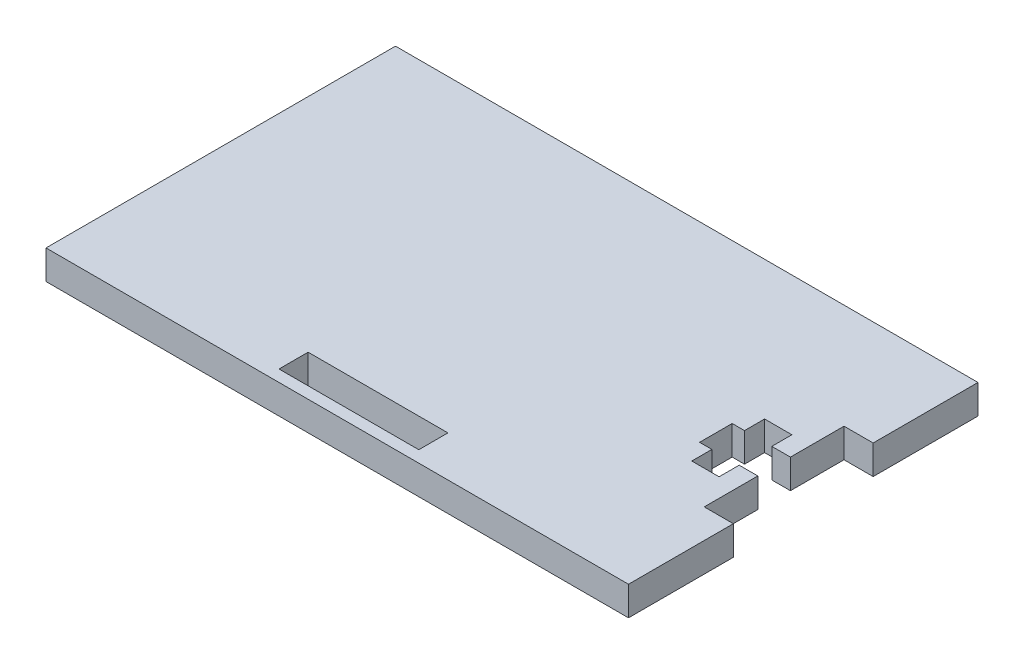
ISO-10303-21;
HEADER;
FILE_DESCRIPTION(('STEP AP214'),'2;1');
FILE_NAME('part.step','',(''),(''),'','','');
FILE_SCHEMA(('AUTOMOTIVE_DESIGN { 1 0 10303 214 1 1 1 1 }'));
ENDSEC;
DATA;
#1=APPLICATION_CONTEXT('core data for automotive mechanical design processes');
#2=APPLICATION_PROTOCOL_DEFINITION('international standard','automotive_design',2000,#1);
#3=PRODUCT_CONTEXT('',#1,'mechanical');
#4=PRODUCT('Part','Part','',(#3));
#5=PRODUCT_RELATED_PRODUCT_CATEGORY('part','',(#4));
#6=PRODUCT_DEFINITION_FORMATION('','',#4);
#7=PRODUCT_DEFINITION_CONTEXT('part definition',#1,'design');
#8=PRODUCT_DEFINITION('design','',#6,#7);
#9=PRODUCT_DEFINITION_SHAPE('','',#8);
#10=(LENGTH_UNIT() NAMED_UNIT(*) SI_UNIT(.MILLI.,.METRE.));
#11=(NAMED_UNIT(*) PLANE_ANGLE_UNIT() SI_UNIT($,.RADIAN.));
#12=(NAMED_UNIT(*) SI_UNIT($,.STERADIAN.) SOLID_ANGLE_UNIT());
#13=UNCERTAINTY_MEASURE_WITH_UNIT(LENGTH_MEASURE(1.E-05),#10,'distance_accuracy_value','');
#14=(GEOMETRIC_REPRESENTATION_CONTEXT(3) GLOBAL_UNCERTAINTY_ASSIGNED_CONTEXT((#13)) GLOBAL_UNIT_ASSIGNED_CONTEXT((#10,
#11,#12)) REPRESENTATION_CONTEXT('',''));
#15=CARTESIAN_POINT('',(0.,0.,0.));
#16=DIRECTION('',(0.,0.,1.));
#17=DIRECTION('',(1.,0.,0.));
#18=AXIS2_PLACEMENT_3D('',#15,#16,#17);
#19=CARTESIAN_POINT('',(0.,3.175,0.));
#20=DIRECTION('',(0.,-1.,0.));
#21=DIRECTION('',(0.,0.,-1.));
#22=AXIS2_PLACEMENT_3D('',#19,#20,#21);
#23=PLANE('',#22);
#24=DIRECTION('',(0.,0.,1.));
#25=VECTOR('',#24,1.);
#26=CARTESIAN_POINT('',(0.,3.175,0.));
#27=LINE('',#26,#25);
#28=CARTESIAN_POINT('',(0.,3.175,-38.1));
#29=VERTEX_POINT('',#28);
#30=CARTESIAN_POINT('',(0.,3.175,0.));
#31=VERTEX_POINT('',#30);
#32=EDGE_CURVE('E230',#29,#31,#27,.T.);
#33=ORIENTED_EDGE('',*,*,#32,.T.);
#34=DIRECTION('',(1.,0.,0.));
#35=VECTOR('',#34,1.);
#36=CARTESIAN_POINT('',(0.,3.175,0.));
#37=LINE('',#36,#35);
#38=CARTESIAN_POINT('',(63.5,3.175,0.));
#39=VERTEX_POINT('',#38);
#40=EDGE_CURVE('E233',#31,#39,#37,.T.);
#41=ORIENTED_EDGE('',*,*,#40,.T.);
#42=DIRECTION('',(0.,0.,-1.));
#43=VECTOR('',#42,1.);
#44=CARTESIAN_POINT('',(63.5,3.175,0.));
#45=LINE('',#44,#43);
#46=CARTESIAN_POINT('',(63.5,3.175,-11.43));
#47=VERTEX_POINT('',#46);
#48=EDGE_CURVE('E236',#39,#47,#45,.T.);
#49=ORIENTED_EDGE('',*,*,#48,.T.);
#50=DIRECTION('',(-1.,0.,0.));
#51=VECTOR('',#50,1.);
#52=CARTESIAN_POINT('',(60.325,3.175,-11.43));
#53=LINE('',#52,#51);
#54=CARTESIAN_POINT('',(60.325,3.175,-11.43));
#55=VERTEX_POINT('',#54);
#56=EDGE_CURVE('E238',#47,#55,#53,.T.);
#57=ORIENTED_EDGE('',*,*,#56,.T.);
#58=DIRECTION('',(0.,0.,-1.));
#59=VECTOR('',#58,1.);
#60=CARTESIAN_POINT('',(60.325,3.175,-17.272));
#61=LINE('',#60,#59);
#62=CARTESIAN_POINT('',(60.325,3.175,-17.272));
#63=VERTEX_POINT('',#62);
#64=EDGE_CURVE('E240',#55,#63,#61,.T.);
#65=ORIENTED_EDGE('',*,*,#64,.T.);
#66=DIRECTION('',(-1.,0.,0.));
#67=VECTOR('',#66,1.);
#68=CARTESIAN_POINT('',(58.293,3.175,-17.272));
#69=LINE('',#68,#67);
#70=CARTESIAN_POINT('',(58.293,3.175,-17.272));
#71=VERTEX_POINT('',#70);
#72=EDGE_CURVE('E242',#63,#71,#69,.T.);
#73=ORIENTED_EDGE('',*,*,#72,.T.);
#74=DIRECTION('',(0.,0.,1.));
#75=VECTOR('',#74,1.);
#76=CARTESIAN_POINT('',(58.293,3.175,-17.272));
#77=LINE('',#76,#75);
#78=CARTESIAN_POINT('',(58.293,3.175,-15.08125));
#79=VERTEX_POINT('',#78);
#80=EDGE_CURVE('E244',#71,#79,#77,.T.);
#81=ORIENTED_EDGE('',*,*,#80,.T.);
#82=DIRECTION('',(-1.,0.,0.));
#83=VECTOR('',#82,1.);
#84=CARTESIAN_POINT('',(55.3164375,3.175,-15.08125));
#85=LINE('',#84,#83);
#86=CARTESIAN_POINT('',(55.3164375,3.175,-15.08125));
#87=VERTEX_POINT('',#86);
#88=EDGE_CURVE('E246',#79,#87,#85,.T.);
#89=ORIENTED_EDGE('',*,*,#88,.T.);
#90=DIRECTION('',(0.,0.,-1.));
#91=VECTOR('',#90,1.);
#92=CARTESIAN_POINT('',(55.3164375,3.175,-17.272));
#93=LINE('',#92,#91);
#94=CARTESIAN_POINT('',(55.3164375,3.175,-17.272));
#95=VERTEX_POINT('',#94);
#96=EDGE_CURVE('E248',#87,#95,#93,.T.);
#97=ORIENTED_EDGE('',*,*,#96,.T.);
#98=DIRECTION('',(-1.,0.,0.));
#99=VECTOR('',#98,1.);
#100=CARTESIAN_POINT('',(53.975,3.175,-17.272));
#101=LINE('',#100,#99);
#102=CARTESIAN_POINT('',(53.975,3.175,-17.272));
#103=VERTEX_POINT('',#102);
#104=EDGE_CURVE('E250',#95,#103,#101,.T.);
#105=ORIENTED_EDGE('',*,*,#104,.T.);
#106=DIRECTION('',(0.,0.,-1.));
#107=VECTOR('',#106,1.);
#108=CARTESIAN_POINT('',(53.975,3.175,-20.828));
#109=LINE('',#108,#107);
#110=CARTESIAN_POINT('',(53.975,3.175,-20.828));
#111=VERTEX_POINT('',#110);
#112=EDGE_CURVE('E252',#103,#111,#109,.T.);
#113=ORIENTED_EDGE('',*,*,#112,.T.);
#114=DIRECTION('',(1.,0.,0.));
#115=VECTOR('',#114,1.);
#116=CARTESIAN_POINT('',(53.975,3.175,-20.828));
#117=LINE('',#116,#115);
#118=CARTESIAN_POINT('',(55.3164375,3.175,-20.828));
#119=VERTEX_POINT('',#118);
#120=EDGE_CURVE('E254',#111,#119,#117,.T.);
#121=ORIENTED_EDGE('',*,*,#120,.T.);
#122=DIRECTION('',(0.,0.,-1.));
#123=VECTOR('',#122,1.);
#124=CARTESIAN_POINT('',(55.3164375,3.175,-23.01875));
#125=LINE('',#124,#123);
#126=CARTESIAN_POINT('',(55.3164375,3.175,-23.01875));
#127=VERTEX_POINT('',#126);
#128=EDGE_CURVE('E256',#119,#127,#125,.T.);
#129=ORIENTED_EDGE('',*,*,#128,.T.);
#130=DIRECTION('',(1.,0.,0.));
#131=VECTOR('',#130,1.);
#132=CARTESIAN_POINT('',(55.3164375,3.175,-23.01875));
#133=LINE('',#132,#131);
#134=CARTESIAN_POINT('',(58.293,3.175,-23.01875));
#135=VERTEX_POINT('',#134);
#136=EDGE_CURVE('E258',#127,#135,#133,.T.);
#137=ORIENTED_EDGE('',*,*,#136,.T.);
#138=DIRECTION('',(0.,0.,1.));
#139=VECTOR('',#138,1.);
#140=CARTESIAN_POINT('',(58.293,3.175,-23.01875));
#141=LINE('',#140,#139);
#142=CARTESIAN_POINT('',(58.293,3.175,-20.828));
#143=VERTEX_POINT('',#142);
#144=EDGE_CURVE('E260',#135,#143,#141,.T.);
#145=ORIENTED_EDGE('',*,*,#144,.T.);
#146=DIRECTION('',(1.,0.,0.));
#147=VECTOR('',#146,1.);
#148=CARTESIAN_POINT('',(58.293,3.175,-20.828));
#149=LINE('',#148,#147);
#150=CARTESIAN_POINT('',(60.325,3.175,-20.828));
#151=VERTEX_POINT('',#150);
#152=EDGE_CURVE('E262',#143,#151,#149,.T.);
#153=ORIENTED_EDGE('',*,*,#152,.T.);
#154=DIRECTION('',(0.,0.,-1.));
#155=VECTOR('',#154,1.);
#156=CARTESIAN_POINT('',(60.325,3.175,-26.67));
#157=LINE('',#156,#155);
#158=CARTESIAN_POINT('',(60.325,3.175,-26.67));
#159=VERTEX_POINT('',#158);
#160=EDGE_CURVE('E264',#151,#159,#157,.T.);
#161=ORIENTED_EDGE('',*,*,#160,.T.);
#162=DIRECTION('',(1.,0.,0.));
#163=VECTOR('',#162,1.);
#164=CARTESIAN_POINT('',(63.5,3.175,-26.67));
#165=LINE('',#164,#163);
#166=CARTESIAN_POINT('',(63.5,3.175,-26.67));
#167=VERTEX_POINT('',#166);
#168=EDGE_CURVE('E266',#159,#167,#165,.T.);
#169=ORIENTED_EDGE('',*,*,#168,.T.);
#170=DIRECTION('',(0.,0.,-1.));
#171=VECTOR('',#170,1.);
#172=CARTESIAN_POINT('',(63.5,3.175,-26.67));
#173=LINE('',#172,#171);
#174=CARTESIAN_POINT('',(63.5,3.175,-38.1));
#175=VERTEX_POINT('',#174);
#176=EDGE_CURVE('E268',#167,#175,#173,.T.);
#177=ORIENTED_EDGE('',*,*,#176,.T.);
#178=DIRECTION('',(-1.,0.,0.));
#179=VECTOR('',#178,1.);
#180=CARTESIAN_POINT('',(0.,3.175,-38.1));
#181=LINE('',#180,#179);
#182=EDGE_CURVE('E270',#175,#29,#181,.T.);
#183=ORIENTED_EDGE('',*,*,#182,.T.);
#184=EDGE_LOOP('',(#33,#41,#49,#57,#65,#73,#81,#89,#97,#105,#113,#121,#129,#137,#145,#153,#161,
#169,#177,#183));
#185=FACE_BOUND('',#184,.T.);
#186=DIRECTION('',(0.,0.,1.));
#187=VECTOR('',#186,1.);
#188=CARTESIAN_POINT('',(24.13,3.175,-4.445));
#189=LINE('',#188,#187);
#190=CARTESIAN_POINT('',(24.13,3.175,-4.445));
#191=VERTEX_POINT('',#190);
#192=CARTESIAN_POINT('',(24.13,3.175,-1.27));
#193=VERTEX_POINT('',#192);
#194=EDGE_CURVE('E194',#191,#193,#189,.T.);
#195=ORIENTED_EDGE('',*,*,#194,.F.);
#196=DIRECTION('',(-1.,0.,0.));
#197=VECTOR('',#196,1.);
#198=CARTESIAN_POINT('',(24.13,3.175,-4.445));
#199=LINE('',#198,#197);
#200=CARTESIAN_POINT('',(39.37,3.175,-4.445));
#201=VERTEX_POINT('',#200);
#202=EDGE_CURVE('E216',#201,#191,#199,.T.);
#203=ORIENTED_EDGE('',*,*,#202,.F.);
#204=DIRECTION('',(0.,0.,-1.));
#205=VECTOR('',#204,1.);
#206=CARTESIAN_POINT('',(39.37,3.175,-4.445));
#207=LINE('',#206,#205);
#208=CARTESIAN_POINT('',(39.37,3.175,-1.27));
#209=VERTEX_POINT('',#208);
#210=EDGE_CURVE('E214',#209,#201,#207,.T.);
#211=ORIENTED_EDGE('',*,*,#210,.F.);
#212=DIRECTION('',(1.,0.,0.));
#213=VECTOR('',#212,1.);
#214=CARTESIAN_POINT('',(24.13,3.175,-1.27));
#215=LINE('',#214,#213);
#216=EDGE_CURVE('E202',#193,#209,#215,.T.);
#217=ORIENTED_EDGE('',*,*,#216,.F.);
#218=EDGE_LOOP('',(#195,#203,#211,#217));
#219=FACE_BOUND('',#218,.T.);
#220=ADVANCED_FACE('F33',(#185,#219),#23,.F.);
#221=CARTESIAN_POINT('',(0.,0.,0.));
#222=DIRECTION('',(0.,-1.,0.));
#223=DIRECTION('',(0.,0.,-1.));
#224=AXIS2_PLACEMENT_3D('',#221,#222,#223);
#225=PLANE('',#224);
#226=DIRECTION('',(0.,0.,1.));
#227=VECTOR('',#226,1.);
#228=CARTESIAN_POINT('',(0.,0.,0.));
#229=LINE('',#228,#227);
#230=CARTESIAN_POINT('',(0.,0.,-38.1));
#231=VERTEX_POINT('',#230);
#232=CARTESIAN_POINT('',(0.,0.,0.));
#233=VERTEX_POINT('',#232);
#234=EDGE_CURVE('E210',#231,#233,#229,.T.);
#235=ORIENTED_EDGE('',*,*,#234,.F.);
#236=DIRECTION('',(-1.,0.,0.));
#237=VECTOR('',#236,1.);
#238=CARTESIAN_POINT('',(0.,0.,-38.1));
#239=LINE('',#238,#237);
#240=CARTESIAN_POINT('',(63.5,0.,-38.1));
#241=VERTEX_POINT('',#240);
#242=EDGE_CURVE('E234',#241,#231,#239,.T.);
#243=ORIENTED_EDGE('',*,*,#242,.F.);
#244=DIRECTION('',(0.,0.,-1.));
#245=VECTOR('',#244,1.);
#246=CARTESIAN_POINT('',(63.5,0.,-26.67));
#247=LINE('',#246,#245);
#248=CARTESIAN_POINT('',(63.5,0.,-26.67));
#249=VERTEX_POINT('',#248);
#250=EDGE_CURVE('E309',#249,#241,#247,.T.);
#251=ORIENTED_EDGE('',*,*,#250,.F.);
#252=DIRECTION('',(1.,0.,0.));
#253=VECTOR('',#252,1.);
#254=CARTESIAN_POINT('',(63.5,0.,-26.67));
#255=LINE('',#254,#253);
#256=CARTESIAN_POINT('',(60.325,0.,-26.67));
#257=VERTEX_POINT('',#256);
#258=EDGE_CURVE('E307',#257,#249,#255,.T.);
#259=ORIENTED_EDGE('',*,*,#258,.F.);
#260=DIRECTION('',(0.,0.,-1.));
#261=VECTOR('',#260,1.);
#262=CARTESIAN_POINT('',(60.325,0.,-26.67));
#263=LINE('',#262,#261);
#264=CARTESIAN_POINT('',(60.325,0.,-20.828));
#265=VERTEX_POINT('',#264);
#266=EDGE_CURVE('E305',#265,#257,#263,.T.);
#267=ORIENTED_EDGE('',*,*,#266,.F.);
#268=DIRECTION('',(1.,0.,0.));
#269=VECTOR('',#268,1.);
#270=CARTESIAN_POINT('',(58.293,0.,-20.828));
#271=LINE('',#270,#269);
#272=CARTESIAN_POINT('',(58.293,0.,-20.828));
#273=VERTEX_POINT('',#272);
#274=EDGE_CURVE('E303',#273,#265,#271,.T.);
#275=ORIENTED_EDGE('',*,*,#274,.F.);
#276=DIRECTION('',(0.,0.,1.));
#277=VECTOR('',#276,1.);
#278=CARTESIAN_POINT('',(58.293,0.,-23.01875));
#279=LINE('',#278,#277);
#280=CARTESIAN_POINT('',(58.293,0.,-23.01875));
#281=VERTEX_POINT('',#280);
#282=EDGE_CURVE('E301',#281,#273,#279,.T.);
#283=ORIENTED_EDGE('',*,*,#282,.F.);
#284=DIRECTION('',(1.,0.,0.));
#285=VECTOR('',#284,1.);
#286=CARTESIAN_POINT('',(55.3164375,0.,-23.01875));
#287=LINE('',#286,#285);
#288=CARTESIAN_POINT('',(55.3164375,0.,-23.01875));
#289=VERTEX_POINT('',#288);
#290=EDGE_CURVE('E299',#289,#281,#287,.T.);
#291=ORIENTED_EDGE('',*,*,#290,.F.);
#292=DIRECTION('',(0.,0.,-1.));
#293=VECTOR('',#292,1.);
#294=CARTESIAN_POINT('',(55.3164375,0.,-23.01875));
#295=LINE('',#294,#293);
#296=CARTESIAN_POINT('',(55.3164375,0.,-20.828));
#297=VERTEX_POINT('',#296);
#298=EDGE_CURVE('E297',#297,#289,#295,.T.);
#299=ORIENTED_EDGE('',*,*,#298,.F.);
#300=DIRECTION('',(1.,0.,0.));
#301=VECTOR('',#300,1.);
#302=CARTESIAN_POINT('',(53.975,0.,-20.828));
#303=LINE('',#302,#301);
#304=CARTESIAN_POINT('',(53.975,0.,-20.828));
#305=VERTEX_POINT('',#304);
#306=EDGE_CURVE('E295',#305,#297,#303,.T.);
#307=ORIENTED_EDGE('',*,*,#306,.F.);
#308=DIRECTION('',(0.,0.,-1.));
#309=VECTOR('',#308,1.);
#310=CARTESIAN_POINT('',(53.975,0.,-20.828));
#311=LINE('',#310,#309);
#312=CARTESIAN_POINT('',(53.975,0.,-17.272));
#313=VERTEX_POINT('',#312);
#314=EDGE_CURVE('E293',#313,#305,#311,.T.);
#315=ORIENTED_EDGE('',*,*,#314,.F.);
#316=DIRECTION('',(-1.,0.,0.));
#317=VECTOR('',#316,1.);
#318=CARTESIAN_POINT('',(53.975,0.,-17.272));
#319=LINE('',#318,#317);
#320=CARTESIAN_POINT('',(55.3164375,0.,-17.272));
#321=VERTEX_POINT('',#320);
#322=EDGE_CURVE('E291',#321,#313,#319,.T.);
#323=ORIENTED_EDGE('',*,*,#322,.F.);
#324=DIRECTION('',(0.,0.,-1.));
#325=VECTOR('',#324,1.);
#326=CARTESIAN_POINT('',(55.3164375,0.,-17.272));
#327=LINE('',#326,#325);
#328=CARTESIAN_POINT('',(55.3164375,0.,-15.08125));
#329=VERTEX_POINT('',#328);
#330=EDGE_CURVE('E289',#329,#321,#327,.T.);
#331=ORIENTED_EDGE('',*,*,#330,.F.);
#332=DIRECTION('',(-1.,0.,0.));
#333=VECTOR('',#332,1.);
#334=CARTESIAN_POINT('',(55.3164375,0.,-15.08125));
#335=LINE('',#334,#333);
#336=CARTESIAN_POINT('',(58.293,0.,-15.08125));
#337=VERTEX_POINT('',#336);
#338=EDGE_CURVE('E287',#337,#329,#335,.T.);
#339=ORIENTED_EDGE('',*,*,#338,.F.);
#340=DIRECTION('',(0.,0.,1.));
#341=VECTOR('',#340,1.);
#342=CARTESIAN_POINT('',(58.293,0.,-17.272));
#343=LINE('',#342,#341);
#344=CARTESIAN_POINT('',(58.293,0.,-17.272));
#345=VERTEX_POINT('',#344);
#346=EDGE_CURVE('E285',#345,#337,#343,.T.);
#347=ORIENTED_EDGE('',*,*,#346,.F.);
#348=DIRECTION('',(-1.,0.,0.));
#349=VECTOR('',#348,1.);
#350=CARTESIAN_POINT('',(58.293,0.,-17.272));
#351=LINE('',#350,#349);
#352=CARTESIAN_POINT('',(60.325,0.,-17.272));
#353=VERTEX_POINT('',#352);
#354=EDGE_CURVE('E283',#353,#345,#351,.T.);
#355=ORIENTED_EDGE('',*,*,#354,.F.);
#356=DIRECTION('',(0.,0.,-1.));
#357=VECTOR('',#356,1.);
#358=CARTESIAN_POINT('',(60.325,0.,-17.272));
#359=LINE('',#358,#357);
#360=CARTESIAN_POINT('',(60.325,0.,-11.43));
#361=VERTEX_POINT('',#360);
#362=EDGE_CURVE('E281',#361,#353,#359,.T.);
#363=ORIENTED_EDGE('',*,*,#362,.F.);
#364=DIRECTION('',(-1.,0.,0.));
#365=VECTOR('',#364,1.);
#366=CARTESIAN_POINT('',(60.325,0.,-11.43));
#367=LINE('',#366,#365);
#368=CARTESIAN_POINT('',(63.5,0.,-11.43));
#369=VERTEX_POINT('',#368);
#370=EDGE_CURVE('E279',#369,#361,#367,.T.);
#371=ORIENTED_EDGE('',*,*,#370,.F.);
#372=DIRECTION('',(0.,0.,-1.));
#373=VECTOR('',#372,1.);
#374=CARTESIAN_POINT('',(63.5,0.,0.));
#375=LINE('',#374,#373);
#376=CARTESIAN_POINT('',(63.5,0.,0.));
#377=VERTEX_POINT('',#376);
#378=EDGE_CURVE('E277',#377,#369,#375,.T.);
#379=ORIENTED_EDGE('',*,*,#378,.F.);
#380=DIRECTION('',(1.,0.,0.));
#381=VECTOR('',#380,1.);
#382=CARTESIAN_POINT('',(0.,0.,0.));
#383=LINE('',#382,#381);
#384=EDGE_CURVE('E275',#233,#377,#383,.T.);
#385=ORIENTED_EDGE('',*,*,#384,.F.);
#386=EDGE_LOOP('',(#235,#243,#251,#259,#267,#275,#283,#291,#299,#307,#315,#323,#331,#339,#347,
#355,#363,#371,#379,#385));
#387=FACE_BOUND('',#386,.T.);
#388=DIRECTION('',(-1.,0.,0.));
#389=VECTOR('',#388,1.);
#390=CARTESIAN_POINT('',(24.13,0.,-4.445));
#391=LINE('',#390,#389);
#392=CARTESIAN_POINT('',(39.37,0.,-4.445));
#393=VERTEX_POINT('',#392);
#394=CARTESIAN_POINT('',(24.13,0.,-4.445));
#395=VERTEX_POINT('',#394);
#396=EDGE_CURVE('E203',#393,#395,#391,.T.);
#397=ORIENTED_EDGE('',*,*,#396,.T.);
#398=DIRECTION('',(0.,0.,1.));
#399=VECTOR('',#398,1.);
#400=CARTESIAN_POINT('',(24.13,0.,-4.445));
#401=LINE('',#400,#399);
#402=CARTESIAN_POINT('',(24.13,0.,-1.27));
#403=VERTEX_POINT('',#402);
#404=EDGE_CURVE('E56',#395,#403,#401,.T.);
#405=ORIENTED_EDGE('',*,*,#404,.T.);
#406=DIRECTION('',(1.,0.,0.));
#407=VECTOR('',#406,1.);
#408=CARTESIAN_POINT('',(24.13,0.,-1.27));
#409=LINE('',#408,#407);
#410=CARTESIAN_POINT('',(39.37,0.,-1.27));
#411=VERTEX_POINT('',#410);
#412=EDGE_CURVE('E209',#403,#411,#409,.T.);
#413=ORIENTED_EDGE('',*,*,#412,.T.);
#414=DIRECTION('',(0.,0.,-1.));
#415=VECTOR('',#414,1.);
#416=CARTESIAN_POINT('',(39.37,0.,-4.445));
#417=LINE('',#416,#415);
#418=EDGE_CURVE('E222',#411,#393,#417,.T.);
#419=ORIENTED_EDGE('',*,*,#418,.T.);
#420=EDGE_LOOP('',(#397,#405,#413,#419));
#421=FACE_BOUND('',#420,.T.);
#422=ADVANCED_FACE('F375',(#387,#421),#225,.T.);
#423=CARTESIAN_POINT('',(0.,3.175,0.));
#424=DIRECTION('',(1.,0.,0.));
#425=DIRECTION('',(0.,0.,-1.));
#426=AXIS2_PLACEMENT_3D('',#423,#424,#425);
#427=PLANE('',#426);
#428=ORIENTED_EDGE('',*,*,#234,.T.);
#429=DIRECTION('',(0.,-1.,0.));
#430=VECTOR('',#429,1.);
#431=CARTESIAN_POINT('',(0.,3.175,0.));
#432=LINE('',#431,#430);
#433=EDGE_CURVE('E11',#31,#233,#432,.T.);
#434=ORIENTED_EDGE('',*,*,#433,.F.);
#435=ORIENTED_EDGE('',*,*,#32,.F.);
#436=DIRECTION('',(0.,-1.,0.));
#437=VECTOR('',#436,1.);
#438=CARTESIAN_POINT('',(0.,3.175,-38.1));
#439=LINE('',#438,#437);
#440=EDGE_CURVE('E272',#29,#231,#439,.T.);
#441=ORIENTED_EDGE('',*,*,#440,.T.);
#442=EDGE_LOOP('',(#428,#434,#435,#441));
#443=FACE_BOUND('',#442,.T.);
#444=ADVANCED_FACE('F35',(#443),#427,.F.);
#445=CARTESIAN_POINT('',(0.,3.175,0.));
#446=DIRECTION('',(0.,0.,-1.));
#447=DIRECTION('',(-1.,0.,0.));
#448=AXIS2_PLACEMENT_3D('',#445,#446,#447);
#449=PLANE('',#448);
#450=ORIENTED_EDGE('',*,*,#384,.T.);
#451=DIRECTION('',(0.,-1.,0.));
#452=VECTOR('',#451,1.);
#453=CARTESIAN_POINT('',(63.5,3.175,0.));
#454=LINE('',#453,#452);
#455=EDGE_CURVE('E41',#39,#377,#454,.T.);
#456=ORIENTED_EDGE('',*,*,#455,.F.);
#457=ORIENTED_EDGE('',*,*,#40,.F.);
#458=ORIENTED_EDGE('',*,*,#433,.T.);
#459=EDGE_LOOP('',(#450,#456,#457,#458));
#460=FACE_BOUND('',#459,.T.);
#461=ADVANCED_FACE('F392',(#460),#449,.F.);
#462=CARTESIAN_POINT('',(63.5,3.175,0.));
#463=DIRECTION('',(-1.,0.,0.));
#464=DIRECTION('',(0.,0.,1.));
#465=AXIS2_PLACEMENT_3D('',#462,#463,#464);
#466=PLANE('',#465);
#467=ORIENTED_EDGE('',*,*,#378,.T.);
#468=DIRECTION('',(0.,-1.,0.));
#469=VECTOR('',#468,1.);
#470=CARTESIAN_POINT('',(63.5,3.175,-11.43));
#471=LINE('',#470,#469);
#472=EDGE_CURVE('E362',#47,#369,#471,.T.);
#473=ORIENTED_EDGE('',*,*,#472,.F.);
#474=ORIENTED_EDGE('',*,*,#48,.F.);
#475=ORIENTED_EDGE('',*,*,#455,.T.);
#476=EDGE_LOOP('',(#467,#473,#474,#475));
#477=FACE_BOUND('',#476,.T.);
#478=ADVANCED_FACE('F369',(#477),#466,.F.);
#479=CARTESIAN_POINT('',(60.325,3.175,-11.43));
#480=DIRECTION('',(0.,0.,1.));
#481=DIRECTION('',(1.,0.,0.));
#482=AXIS2_PLACEMENT_3D('',#479,#480,#481);
#483=PLANE('',#482);
#484=ORIENTED_EDGE('',*,*,#370,.T.);
#485=DIRECTION('',(0.,-1.,0.));
#486=VECTOR('',#485,1.);
#487=CARTESIAN_POINT('',(60.325,3.175,-11.43));
#488=LINE('',#487,#486);
#489=EDGE_CURVE('E359',#55,#361,#488,.T.);
#490=ORIENTED_EDGE('',*,*,#489,.F.);
#491=ORIENTED_EDGE('',*,*,#56,.F.);
#492=ORIENTED_EDGE('',*,*,#472,.T.);
#493=EDGE_LOOP('',(#484,#490,#491,#492));
#494=FACE_BOUND('',#493,.T.);
#495=ADVANCED_FACE('F381',(#494),#483,.F.);
#496=CARTESIAN_POINT('',(60.325,3.175,-17.272));
#497=DIRECTION('',(-1.,0.,0.));
#498=DIRECTION('',(0.,0.,1.));
#499=AXIS2_PLACEMENT_3D('',#496,#497,#498);
#500=PLANE('',#499);
#501=ORIENTED_EDGE('',*,*,#362,.T.);
#502=DIRECTION('',(0.,-1.,0.));
#503=VECTOR('',#502,1.);
#504=CARTESIAN_POINT('',(60.325,3.175,-17.272));
#505=LINE('',#504,#503);
#506=EDGE_CURVE('E356',#63,#353,#505,.T.);
#507=ORIENTED_EDGE('',*,*,#506,.F.);
#508=ORIENTED_EDGE('',*,*,#64,.F.);
#509=ORIENTED_EDGE('',*,*,#489,.T.);
#510=EDGE_LOOP('',(#501,#507,#508,#509));
#511=FACE_BOUND('',#510,.T.);
#512=ADVANCED_FACE('F385',(#511),#500,.F.);
#513=CARTESIAN_POINT('',(58.293,3.175,-17.272));
#514=DIRECTION('',(0.,0.,1.));
#515=DIRECTION('',(1.,0.,0.));
#516=AXIS2_PLACEMENT_3D('',#513,#514,#515);
#517=PLANE('',#516);
#518=ORIENTED_EDGE('',*,*,#354,.T.);
#519=DIRECTION('',(0.,-1.,0.));
#520=VECTOR('',#519,1.);
#521=CARTESIAN_POINT('',(58.293,3.175,-17.272));
#522=LINE('',#521,#520);
#523=EDGE_CURVE('E353',#71,#345,#522,.T.);
#524=ORIENTED_EDGE('',*,*,#523,.F.);
#525=ORIENTED_EDGE('',*,*,#72,.F.);
#526=ORIENTED_EDGE('',*,*,#506,.T.);
#527=EDGE_LOOP('',(#518,#524,#525,#526));
#528=FACE_BOUND('',#527,.T.);
#529=ADVANCED_FACE('F465',(#528),#517,.F.);
#530=CARTESIAN_POINT('',(58.293,3.175,-17.272));
#531=DIRECTION('',(1.,0.,0.));
#532=DIRECTION('',(0.,0.,-1.));
#533=AXIS2_PLACEMENT_3D('',#530,#531,#532);
#534=PLANE('',#533);
#535=ORIENTED_EDGE('',*,*,#346,.T.);
#536=DIRECTION('',(0.,-1.,0.));
#537=VECTOR('',#536,1.);
#538=CARTESIAN_POINT('',(58.293,3.175,-15.08125));
#539=LINE('',#538,#537);
#540=EDGE_CURVE('E350',#79,#337,#539,.T.);
#541=ORIENTED_EDGE('',*,*,#540,.F.);
#542=ORIENTED_EDGE('',*,*,#80,.F.);
#543=ORIENTED_EDGE('',*,*,#523,.T.);
#544=EDGE_LOOP('',(#535,#541,#542,#543));
#545=FACE_BOUND('',#544,.T.);
#546=ADVANCED_FACE('F463',(#545),#534,.F.);
#547=CARTESIAN_POINT('',(55.3164375,3.175,-15.08125));
#548=DIRECTION('',(0.,0.,1.));
#549=DIRECTION('',(1.,0.,0.));
#550=AXIS2_PLACEMENT_3D('',#547,#548,#549);
#551=PLANE('',#550);
#552=ORIENTED_EDGE('',*,*,#338,.T.);
#553=DIRECTION('',(0.,-1.,0.));
#554=VECTOR('',#553,1.);
#555=CARTESIAN_POINT('',(55.3164375,3.175,-15.08125));
#556=LINE('',#555,#554);
#557=EDGE_CURVE('E347',#87,#329,#556,.T.);
#558=ORIENTED_EDGE('',*,*,#557,.F.);
#559=ORIENTED_EDGE('',*,*,#88,.F.);
#560=ORIENTED_EDGE('',*,*,#540,.T.);
#561=EDGE_LOOP('',(#552,#558,#559,#560));
#562=FACE_BOUND('',#561,.T.);
#563=ADVANCED_FACE('F458',(#562),#551,.F.);
#564=CARTESIAN_POINT('',(55.3164375,3.175,-17.272));
#565=DIRECTION('',(-1.,0.,0.));
#566=DIRECTION('',(0.,0.,1.));
#567=AXIS2_PLACEMENT_3D('',#564,#565,#566);
#568=PLANE('',#567);
#569=ORIENTED_EDGE('',*,*,#330,.T.);
#570=DIRECTION('',(0.,-1.,0.));
#571=VECTOR('',#570,1.);
#572=CARTESIAN_POINT('',(55.3164375,3.175,-17.272));
#573=LINE('',#572,#571);
#574=EDGE_CURVE('E344',#95,#321,#573,.T.);
#575=ORIENTED_EDGE('',*,*,#574,.F.);
#576=ORIENTED_EDGE('',*,*,#96,.F.);
#577=ORIENTED_EDGE('',*,*,#557,.T.);
#578=EDGE_LOOP('',(#569,#575,#576,#577));
#579=FACE_BOUND('',#578,.T.);
#580=ADVANCED_FACE('F453',(#579),#568,.F.);
#581=CARTESIAN_POINT('',(53.975,3.175,-17.272));
#582=DIRECTION('',(0.,0.,1.));
#583=DIRECTION('',(1.,0.,0.));
#584=AXIS2_PLACEMENT_3D('',#581,#582,#583);
#585=PLANE('',#584);
#586=ORIENTED_EDGE('',*,*,#322,.T.);
#587=DIRECTION('',(0.,-1.,0.));
#588=VECTOR('',#587,1.);
#589=CARTESIAN_POINT('',(53.975,3.175,-17.272));
#590=LINE('',#589,#588);
#591=EDGE_CURVE('E341',#103,#313,#590,.T.);
#592=ORIENTED_EDGE('',*,*,#591,.F.);
#593=ORIENTED_EDGE('',*,*,#104,.F.);
#594=ORIENTED_EDGE('',*,*,#574,.T.);
#595=EDGE_LOOP('',(#586,#592,#593,#594));
#596=FACE_BOUND('',#595,.T.);
#597=ADVANCED_FACE('F449',(#596),#585,.F.);
#598=CARTESIAN_POINT('',(53.975,3.175,-20.828));
#599=DIRECTION('',(-1.,0.,0.));
#600=DIRECTION('',(0.,0.,1.));
#601=AXIS2_PLACEMENT_3D('',#598,#599,#600);
#602=PLANE('',#601);
#603=ORIENTED_EDGE('',*,*,#314,.T.);
#604=DIRECTION('',(0.,-1.,0.));
#605=VECTOR('',#604,1.);
#606=CARTESIAN_POINT('',(53.975,3.175,-20.828));
#607=LINE('',#606,#605);
#608=EDGE_CURVE('E338',#111,#305,#607,.T.);
#609=ORIENTED_EDGE('',*,*,#608,.F.);
#610=ORIENTED_EDGE('',*,*,#112,.F.);
#611=ORIENTED_EDGE('',*,*,#591,.T.);
#612=EDGE_LOOP('',(#603,#609,#610,#611));
#613=FACE_BOUND('',#612,.T.);
#614=ADVANCED_FACE('F444',(#613),#602,.F.);
#615=CARTESIAN_POINT('',(53.975,3.175,-20.828));
#616=DIRECTION('',(0.,0.,-1.));
#617=DIRECTION('',(-1.,0.,0.));
#618=AXIS2_PLACEMENT_3D('',#615,#616,#617);
#619=PLANE('',#618);
#620=ORIENTED_EDGE('',*,*,#306,.T.);
#621=DIRECTION('',(0.,-1.,0.));
#622=VECTOR('',#621,1.);
#623=CARTESIAN_POINT('',(55.3164375,3.175,-20.828));
#624=LINE('',#623,#622);
#625=EDGE_CURVE('E335',#119,#297,#624,.T.);
#626=ORIENTED_EDGE('',*,*,#625,.F.);
#627=ORIENTED_EDGE('',*,*,#120,.F.);
#628=ORIENTED_EDGE('',*,*,#608,.T.);
#629=EDGE_LOOP('',(#620,#626,#627,#628));
#630=FACE_BOUND('',#629,.T.);
#631=ADVANCED_FACE('F438',(#630),#619,.F.);
#632=CARTESIAN_POINT('',(55.3164375,3.175,-23.01875));
#633=DIRECTION('',(-1.,0.,0.));
#634=DIRECTION('',(0.,0.,1.));
#635=AXIS2_PLACEMENT_3D('',#632,#633,#634);
#636=PLANE('',#635);
#637=ORIENTED_EDGE('',*,*,#298,.T.);
#638=DIRECTION('',(0.,-1.,0.));
#639=VECTOR('',#638,1.);
#640=CARTESIAN_POINT('',(55.3164375,3.175,-23.01875));
#641=LINE('',#640,#639);
#642=EDGE_CURVE('E332',#127,#289,#641,.T.);
#643=ORIENTED_EDGE('',*,*,#642,.F.);
#644=ORIENTED_EDGE('',*,*,#128,.F.);
#645=ORIENTED_EDGE('',*,*,#625,.T.);
#646=EDGE_LOOP('',(#637,#643,#644,#645));
#647=FACE_BOUND('',#646,.T.);
#648=ADVANCED_FACE('F434',(#647),#636,.F.);
#649=CARTESIAN_POINT('',(55.3164375,3.175,-23.01875));
#650=DIRECTION('',(0.,0.,-1.));
#651=DIRECTION('',(-1.,0.,0.));
#652=AXIS2_PLACEMENT_3D('',#649,#650,#651);
#653=PLANE('',#652);
#654=ORIENTED_EDGE('',*,*,#290,.T.);
#655=DIRECTION('',(0.,-1.,0.));
#656=VECTOR('',#655,1.);
#657=CARTESIAN_POINT('',(58.293,3.175,-23.01875));
#658=LINE('',#657,#656);
#659=EDGE_CURVE('E329',#135,#281,#658,.T.);
#660=ORIENTED_EDGE('',*,*,#659,.F.);
#661=ORIENTED_EDGE('',*,*,#136,.F.);
#662=ORIENTED_EDGE('',*,*,#642,.T.);
#663=EDGE_LOOP('',(#654,#660,#661,#662));
#664=FACE_BOUND('',#663,.T.);
#665=ADVANCED_FACE('F429',(#664),#653,.F.);
#666=CARTESIAN_POINT('',(58.293,3.175,-23.01875));
#667=DIRECTION('',(1.,0.,0.));
#668=DIRECTION('',(0.,0.,-1.));
#669=AXIS2_PLACEMENT_3D('',#666,#667,#668);
#670=PLANE('',#669);
#671=ORIENTED_EDGE('',*,*,#282,.T.);
#672=DIRECTION('',(0.,-1.,0.));
#673=VECTOR('',#672,1.);
#674=CARTESIAN_POINT('',(58.293,3.175,-20.828));
#675=LINE('',#674,#673);
#676=EDGE_CURVE('E326',#143,#273,#675,.T.);
#677=ORIENTED_EDGE('',*,*,#676,.F.);
#678=ORIENTED_EDGE('',*,*,#144,.F.);
#679=ORIENTED_EDGE('',*,*,#659,.T.);
#680=EDGE_LOOP('',(#671,#677,#678,#679));
#681=FACE_BOUND('',#680,.T.);
#682=ADVANCED_FACE('F423',(#681),#670,.F.);
#683=CARTESIAN_POINT('',(58.293,3.175,-20.828));
#684=DIRECTION('',(0.,0.,-1.));
#685=DIRECTION('',(-1.,0.,0.));
#686=AXIS2_PLACEMENT_3D('',#683,#684,#685);
#687=PLANE('',#686);
#688=ORIENTED_EDGE('',*,*,#274,.T.);
#689=DIRECTION('',(0.,-1.,0.));
#690=VECTOR('',#689,1.);
#691=CARTESIAN_POINT('',(60.325,3.175,-20.828));
#692=LINE('',#691,#690);
#693=EDGE_CURVE('E323',#151,#265,#692,.T.);
#694=ORIENTED_EDGE('',*,*,#693,.F.);
#695=ORIENTED_EDGE('',*,*,#152,.F.);
#696=ORIENTED_EDGE('',*,*,#676,.T.);
#697=EDGE_LOOP('',(#688,#694,#695,#696));
#698=FACE_BOUND('',#697,.T.);
#699=ADVANCED_FACE('F419',(#698),#687,.F.);
#700=CARTESIAN_POINT('',(60.325,3.175,-26.67));
#701=DIRECTION('',(-1.,0.,0.));
#702=DIRECTION('',(0.,0.,1.));
#703=AXIS2_PLACEMENT_3D('',#700,#701,#702);
#704=PLANE('',#703);
#705=ORIENTED_EDGE('',*,*,#266,.T.);
#706=DIRECTION('',(0.,-1.,0.));
#707=VECTOR('',#706,1.);
#708=CARTESIAN_POINT('',(60.325,3.175,-26.67));
#709=LINE('',#708,#707);
#710=EDGE_CURVE('E320',#159,#257,#709,.T.);
#711=ORIENTED_EDGE('',*,*,#710,.F.);
#712=ORIENTED_EDGE('',*,*,#160,.F.);
#713=ORIENTED_EDGE('',*,*,#693,.T.);
#714=EDGE_LOOP('',(#705,#711,#712,#713));
#715=FACE_BOUND('',#714,.T.);
#716=ADVANCED_FACE('F414',(#715),#704,.F.);
#717=CARTESIAN_POINT('',(63.5,3.175,-26.67));
#718=DIRECTION('',(0.,0.,-1.));
#719=DIRECTION('',(-1.,0.,0.));
#720=AXIS2_PLACEMENT_3D('',#717,#718,#719);
#721=PLANE('',#720);
#722=ORIENTED_EDGE('',*,*,#258,.T.);
#723=DIRECTION('',(0.,-1.,0.));
#724=VECTOR('',#723,1.);
#725=CARTESIAN_POINT('',(63.5,3.175,-26.67));
#726=LINE('',#725,#724);
#727=EDGE_CURVE('E317',#167,#249,#726,.T.);
#728=ORIENTED_EDGE('',*,*,#727,.F.);
#729=ORIENTED_EDGE('',*,*,#168,.F.);
#730=ORIENTED_EDGE('',*,*,#710,.T.);
#731=EDGE_LOOP('',(#722,#728,#729,#730));
#732=FACE_BOUND('',#731,.T.);
#733=ADVANCED_FACE('F408',(#732),#721,.F.);
#734=CARTESIAN_POINT('',(63.5,3.175,-26.67));
#735=DIRECTION('',(-1.,0.,0.));
#736=DIRECTION('',(0.,0.,1.));
#737=AXIS2_PLACEMENT_3D('',#734,#735,#736);
#738=PLANE('',#737);
#739=ORIENTED_EDGE('',*,*,#250,.T.);
#740=DIRECTION('',(0.,-1.,0.));
#741=VECTOR('',#740,1.);
#742=CARTESIAN_POINT('',(63.5,3.175,-38.1));
#743=LINE('',#742,#741);
#744=EDGE_CURVE('E314',#175,#241,#743,.T.);
#745=ORIENTED_EDGE('',*,*,#744,.F.);
#746=ORIENTED_EDGE('',*,*,#176,.F.);
#747=ORIENTED_EDGE('',*,*,#727,.T.);
#748=EDGE_LOOP('',(#739,#745,#746,#747));
#749=FACE_BOUND('',#748,.T.);
#750=ADVANCED_FACE('F404',(#749),#738,.F.);
#751=CARTESIAN_POINT('',(0.,3.175,-38.1));
#752=DIRECTION('',(0.,0.,1.));
#753=DIRECTION('',(1.,0.,0.));
#754=AXIS2_PLACEMENT_3D('',#751,#752,#753);
#755=PLANE('',#754);
#756=ORIENTED_EDGE('',*,*,#242,.T.);
#757=ORIENTED_EDGE('',*,*,#440,.F.);
#758=ORIENTED_EDGE('',*,*,#182,.F.);
#759=ORIENTED_EDGE('',*,*,#744,.T.);
#760=EDGE_LOOP('',(#756,#757,#758,#759));
#761=FACE_BOUND('',#760,.T.);
#762=ADVANCED_FACE('F399',(#761),#755,.F.);
#763=CARTESIAN_POINT('',(24.13,3.175,-4.445));
#764=DIRECTION('',(1.,0.,0.));
#765=DIRECTION('',(0.,0.,-1.));
#766=AXIS2_PLACEMENT_3D('',#763,#764,#765);
#767=PLANE('',#766);
#768=ORIENTED_EDGE('',*,*,#404,.F.);
#769=DIRECTION('',(0.,-1.,0.));
#770=VECTOR('',#769,1.);
#771=CARTESIAN_POINT('',(24.13,3.175,-4.445));
#772=LINE('',#771,#770);
#773=EDGE_CURVE('E198',#191,#395,#772,.T.);
#774=ORIENTED_EDGE('',*,*,#773,.F.);
#775=ORIENTED_EDGE('',*,*,#194,.T.);
#776=DIRECTION('',(0.,-1.,0.));
#777=VECTOR('',#776,1.);
#778=CARTESIAN_POINT('',(24.13,3.175,-1.27));
#779=LINE('',#778,#777);
#780=EDGE_CURVE('E197',#193,#403,#779,.T.);
#781=ORIENTED_EDGE('',*,*,#780,.T.);
#782=EDGE_LOOP('',(#768,#774,#775,#781));
#783=FACE_BOUND('',#782,.T.);
#784=ADVANCED_FACE('F196',(#783),#767,.T.);
#785=CARTESIAN_POINT('',(24.13,3.175,-1.27));
#786=DIRECTION('',(0.,0.,-1.));
#787=DIRECTION('',(-1.,0.,0.));
#788=AXIS2_PLACEMENT_3D('',#785,#786,#787);
#789=PLANE('',#788);
#790=ORIENTED_EDGE('',*,*,#412,.F.);
#791=ORIENTED_EDGE('',*,*,#780,.F.);
#792=ORIENTED_EDGE('',*,*,#216,.T.);
#793=DIRECTION('',(0.,-1.,0.));
#794=VECTOR('',#793,1.);
#795=CARTESIAN_POINT('',(39.37,3.175,-1.27));
#796=LINE('',#795,#794);
#797=EDGE_CURVE('E211',#209,#411,#796,.T.);
#798=ORIENTED_EDGE('',*,*,#797,.T.);
#799=EDGE_LOOP('',(#790,#791,#792,#798));
#800=FACE_BOUND('',#799,.T.);
#801=ADVANCED_FACE('F206',(#800),#789,.T.);
#802=CARTESIAN_POINT('',(39.37,3.175,-4.445));
#803=DIRECTION('',(-1.,0.,0.));
#804=DIRECTION('',(0.,0.,1.));
#805=AXIS2_PLACEMENT_3D('',#802,#803,#804);
#806=PLANE('',#805);
#807=ORIENTED_EDGE('',*,*,#418,.F.);
#808=ORIENTED_EDGE('',*,*,#797,.F.);
#809=ORIENTED_EDGE('',*,*,#210,.T.);
#810=DIRECTION('',(0.,-1.,0.));
#811=VECTOR('',#810,1.);
#812=CARTESIAN_POINT('',(39.37,3.175,-4.445));
#813=LINE('',#812,#811);
#814=EDGE_CURVE('E48',#201,#393,#813,.T.);
#815=ORIENTED_EDGE('',*,*,#814,.T.);
#816=EDGE_LOOP('',(#807,#808,#809,#815));
#817=FACE_BOUND('',#816,.T.);
#818=ADVANCED_FACE('F571',(#817),#806,.T.);
#819=CARTESIAN_POINT('',(24.13,3.175,-4.445));
#820=DIRECTION('',(0.,0.,1.));
#821=DIRECTION('',(1.,0.,0.));
#822=AXIS2_PLACEMENT_3D('',#819,#820,#821);
#823=PLANE('',#822);
#824=ORIENTED_EDGE('',*,*,#396,.F.);
#825=ORIENTED_EDGE('',*,*,#814,.F.);
#826=ORIENTED_EDGE('',*,*,#202,.T.);
#827=ORIENTED_EDGE('',*,*,#773,.T.);
#828=EDGE_LOOP('',(#824,#825,#826,#827));
#829=FACE_BOUND('',#828,.T.);
#830=ADVANCED_FACE('F577',(#829),#823,.T.);
#831=CLOSED_SHELL('',(#220,#422,#444,#461,#478,#495,#512,#529,#546,#563,#580,#597,#614,#631,
#648,#665,#682,#699,#716,#733,#750,#762,#784,#801,#818,#830));
#832=MANIFOLD_SOLID_BREP('B2',#831);
#833=ADVANCED_BREP_SHAPE_REPRESENTATION('',(#18,#832),#14);
#834=SHAPE_DEFINITION_REPRESENTATION(#9,#833);
ENDSEC;
END-ISO-10303-21;
